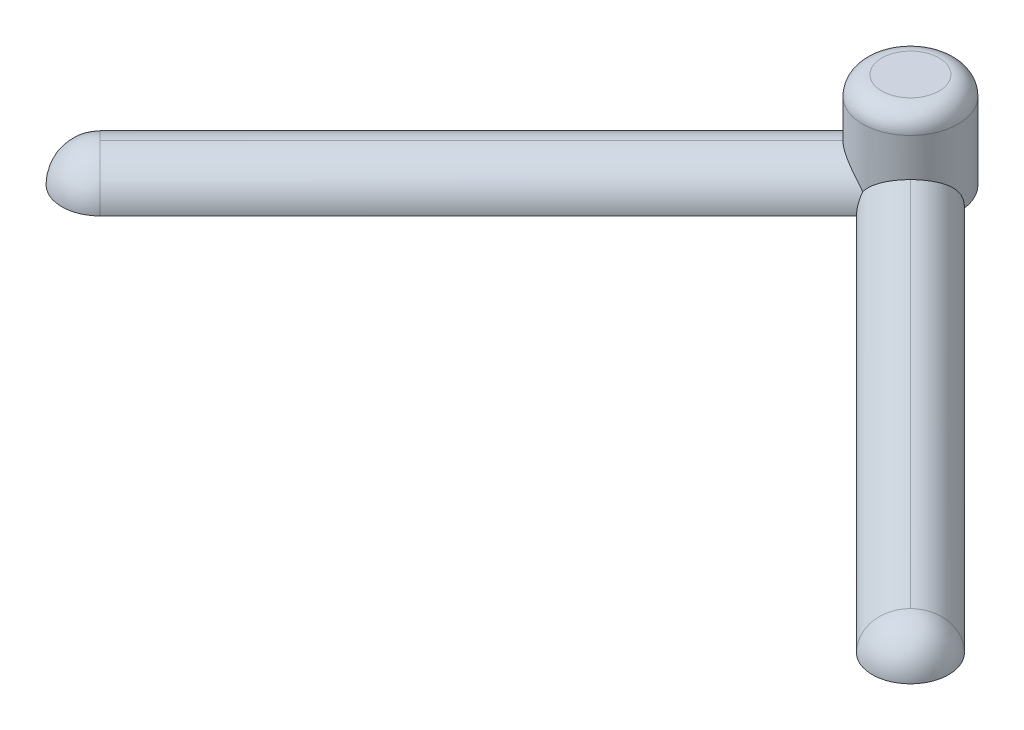
ISO-10303-21;
HEADER;
FILE_DESCRIPTION(('STEP AP214'),'2;1');
FILE_NAME('part.step','',(''),(''),'','','');
FILE_SCHEMA(('AUTOMOTIVE_DESIGN { 1 0 10303 214 1 1 1 1 }'));
ENDSEC;
DATA;
#1=APPLICATION_CONTEXT('core data for automotive mechanical design processes');
#2=APPLICATION_PROTOCOL_DEFINITION('international standard','automotive_design',2000,#1);
#3=PRODUCT_CONTEXT('',#1,'mechanical');
#4=PRODUCT('Part','Part','',(#3));
#5=PRODUCT_RELATED_PRODUCT_CATEGORY('part','',(#4));
#6=PRODUCT_DEFINITION_FORMATION('','',#4);
#7=PRODUCT_DEFINITION_CONTEXT('part definition',#1,'design');
#8=PRODUCT_DEFINITION('design','',#6,#7);
#9=PRODUCT_DEFINITION_SHAPE('','',#8);
#10=(LENGTH_UNIT() NAMED_UNIT(*) SI_UNIT(.MILLI.,.METRE.));
#11=(NAMED_UNIT(*) PLANE_ANGLE_UNIT() SI_UNIT($,.RADIAN.));
#12=(NAMED_UNIT(*) SI_UNIT($,.STERADIAN.) SOLID_ANGLE_UNIT());
#13=UNCERTAINTY_MEASURE_WITH_UNIT(LENGTH_MEASURE(1.E-05),#10,'distance_accuracy_value','');
#14=(GEOMETRIC_REPRESENTATION_CONTEXT(3) GLOBAL_UNCERTAINTY_ASSIGNED_CONTEXT((#13)) GLOBAL_UNIT_ASSIGNED_CONTEXT((#10,
#11,#12)) REPRESENTATION_CONTEXT('',''));
#15=CARTESIAN_POINT('',(0.,0.,0.));
#16=DIRECTION('',(0.,0.,1.));
#17=DIRECTION('',(1.,0.,0.));
#18=AXIS2_PLACEMENT_3D('',#15,#16,#17);
#19=CARTESIAN_POINT('',(-0.000544720985090328,-1.48589260613319,-11.9763136914915));
#20=DIRECTION('',(0.707106781186546,0.,0.707106781186549));
#21=DIRECTION('',(0.707106781186549,0.,-0.707106781186546));
#22=AXIS2_PLACEMENT_3D('',#19,#20,#21);
#23=CYLINDRICAL_SURFACE('',#22,5.08);
#24=DIRECTION('',(0.707106781186546,0.,0.707106781186549));
#25=VECTOR('',#24,1.);
#26=CARTESIAN_POINT('',(3.59155772744258,-1.48589260613319,-15.5684161399192));
#27=LINE('',#26,#25);
#28=CARTESIAN_POINT('',(6.28563456376332,-1.48589260613319,-12.8743393035984));
#29=VERTEX_POINT('',#28);
#30=CARTESIAN_POINT('',(57.4730944538574,-1.48589260613319,38.3131205864958));
#31=VERTEX_POINT('',#30);
#32=EDGE_CURVE('E104',#29,#31,#27,.T.);
#33=ORIENTED_EDGE('',*,*,#32,.F.);
#34=CARTESIAN_POINT('',(6.28563456376332,-1.48589260613319,-12.8743393035984));
#35=CARTESIAN_POINT('',(6.28560687343866,-1.38952133344319,-12.874398590198));
#36=CARTESIAN_POINT('',(6.28628053533132,-1.29318718390793,-12.8698165708757));
#37=CARTESIAN_POINT('',(6.28881998941499,-1.10151987343332,-12.8518347538349));
#38=CARTESIAN_POINT('',(6.29068375900634,-1.00618529258681,-12.8384499154398));
#39=CARTESIAN_POINT('',(6.29536284568703,-0.818369538849554,-12.8035580486937));
#40=CARTESIAN_POINT('',(6.29816517527972,-0.725867278659367,-12.7821614320215));
#41=CARTESIAN_POINT('',(6.30438713683916,-0.542895192935964,-12.7319442844917));
#42=CARTESIAN_POINT('',(6.30780707392281,-0.452426396948914,-12.7031200811618));
#43=CARTESIAN_POINT('',(6.31614420290003,-0.242044772751062,-12.6273596526522));
#44=CARTESIAN_POINT('',(6.32116031625539,-0.123140567235551,-12.5776303500585));
#45=CARTESIAN_POINT('',(6.33063984943054,0.109821550803948,-12.4678760672476));
#46=CARTESIAN_POINT('',(6.33510307545817,0.223877754908712,-12.4078474945246));
#47=CARTESIAN_POINT('',(6.34258103352951,0.447804098219018,-12.2787427023872));
#48=CARTESIAN_POINT('',(6.34558573043553,0.55764057804113,-12.2096078492536));
#49=CARTESIAN_POINT('',(6.34926820412654,0.772385704627742,-12.0639896058536));
#50=CARTESIAN_POINT('',(6.3499452515206,0.877292796566598,-11.9875039198509));
#51=CARTESIAN_POINT('',(6.34792010353161,1.11905266623983,-11.7997278911934));
#52=CARTESIAN_POINT('',(6.34391751786519,1.25385359851076,-11.6858001430698));
#53=CARTESIAN_POINT('',(6.32860898755788,1.51458866629605,-11.4486225902111));
#54=CARTESIAN_POINT('',(6.3173004654991,1.64051965524128,-11.3253695092003));
#55=CARTESIAN_POINT('',(6.28596108010473,1.88305739436845,-11.0715148750922));
#56=CARTESIAN_POINT('',(6.26594854214477,1.99968312856105,-10.9409292601906));
#57=CARTESIAN_POINT('',(6.21589356565084,2.22340230594481,-10.6736604985492));
#58=CARTESIAN_POINT('',(6.18584990646248,2.33049458703135,-10.5369766114851));
#59=CARTESIAN_POINT('',(6.0928785884912,2.5960806183242,-10.1747336347083));
#60=CARTESIAN_POINT('',(6.02105017971605,2.74653410926254,-9.94537576858528));
#61=CARTESIAN_POINT('',(5.84400298290282,3.01590878359584,-9.48125339129859));
#62=CARTESIAN_POINT('',(5.73883042147823,3.13487320533484,-9.24649678009015));
#63=CARTESIAN_POINT('',(5.51235852973103,3.31906099499423,-8.81731920497968));
#64=CARTESIAN_POINT('',(5.39641963312166,3.3898645937583,-8.62251610973942));
#65=CARTESIAN_POINT('',(5.20396235945643,3.47354035705903,-8.33641026097956));
#66=CARTESIAN_POINT('',(5.13669707683882,3.49768092993253,-8.24203261592158));
#67=CARTESIAN_POINT('',(4.99623154509985,3.53811323212339,-8.056074670879));
#68=CARTESIAN_POINT('',(4.92303367850959,3.554408094216,-7.96449326806484));
#69=CARTESIAN_POINT('',(4.77079465256414,3.57893123376448,-7.78456357305909));
#70=CARTESIAN_POINT('',(4.69173166858077,3.58712757183673,-7.69622939472094));
#71=CARTESIAN_POINT('',(4.52860282960779,3.59520178379152,-7.5239675980462));
#72=CARTESIAN_POINT('',(4.44453891877176,3.59508286945693,-7.44003829085488));
#73=CARTESIAN_POINT('',(4.27204162364971,3.58653472500343,-7.27720983376972));
#74=CARTESIAN_POINT('',(4.18360727308806,3.57810364924151,-7.19831180516986));
#75=CARTESIAN_POINT('',(4.00315542420914,3.5530748949364,-7.04611917758313));
#76=CARTESIAN_POINT('',(3.91113800866418,3.53647740494244,-6.97282444927033));
#77=CARTESIAN_POINT('',(3.7294528541865,3.49651506146611,-6.83609733078554));
#78=CARTESIAN_POINT('',(3.63993299863199,3.473571250475,-6.77234451746375));
#79=CARTESIAN_POINT('',(3.45908923476936,3.42094668932426,-6.65040089992663));
#80=CARTESIAN_POINT('',(3.36776475407488,3.3912637693116,-6.59221189573688));
#81=CARTESIAN_POINT('',(3.09212678113641,3.29264885505418,-6.42619784110683));
#82=CARTESIAN_POINT('',(2.90603227577244,3.21412458732896,-6.32683902381194));
#83=CARTESIAN_POINT('',(2.5162709417158,3.02614154974426,-6.14200753609368));
#84=CARTESIAN_POINT('',(2.31264015451776,2.91442986083378,-6.05879799104042));
#85=CARTESIAN_POINT('',(1.91083577401473,2.66815531339362,-5.91705822939811));
#86=CARTESIAN_POINT('',(1.71266395820597,2.53358511176745,-5.85853596449152));
#87=CARTESIAN_POINT('',(1.28601411134143,2.21480841644506,-5.75338507873348));
#88=CARTESIAN_POINT('',(1.05967919967805,2.02608484233434,-5.71167355868476));
#89=CARTESIAN_POINT('',(0.735673659227465,1.72363087044101,-5.66818711425819));
#90=CARTESIAN_POINT('',(0.630106865350904,1.619412559539,-5.65686917368405));
#91=CARTESIAN_POINT('',(0.425146056920984,1.40460582851687,-5.63976592037488));
#92=CARTESIAN_POINT('',(0.325751425191031,1.29401804744131,-5.6339800536323));
#93=CARTESIAN_POINT('',(0.143393804124363,1.07728630889195,-5.6273526674033));
#94=CARTESIAN_POINT('',(0.0597660923152862,0.971713103601933,-5.62609484813119));
#95=CARTESIAN_POINT('',(-0.100367362975639,0.75531027817777,-5.62659399870463));
#96=CARTESIAN_POINT('',(-0.176874545773372,0.644481727205406,-5.62835035787453));
#97=CARTESIAN_POINT('',(-0.320971367772488,0.418162542681024,-5.6339959722248));
#98=CARTESIAN_POINT('',(-0.388613376639751,0.302705090829133,-5.63787193003228));
#99=CARTESIAN_POINT('',(-0.513850861096154,0.0664689904897944,-5.64678310116898));
#100=CARTESIAN_POINT('',(-0.571447797925895,-0.0543088808375658,-5.65181814564008));
#101=CARTESIAN_POINT('',(-0.665899534441111,-0.280222033573186,-5.66112020076014));
#102=CARTESIAN_POINT('',(-0.704613345136965,-0.384577368604516,-5.66537416655974));
#103=CARTESIAN_POINT('',(-0.772388959415728,-0.596350725050921,-5.67330533201825));
#104=CARTESIAN_POINT('',(-0.801457773366283,-0.703766460108495,-5.67698294955955));
#105=CARTESIAN_POINT('',(-0.849106107237057,-0.922762840511855,-5.68321673057724));
#106=CARTESIAN_POINT('',(-0.86751148101897,-1.03438255330598,-5.68575413129931));
#107=CARTESIAN_POINT('',(-0.892314050455706,-1.25926970035718,-5.6892404561162));
#108=CARTESIAN_POINT('',(-0.898678161942967,-1.37254081510208,-5.69018500296845));
#109=CARTESIAN_POINT('',(-0.898570333091884,-1.48589260613326,-5.69013440674293));
#110=B_SPLINE_CURVE_WITH_KNOTS('',3,(#34,#35,#36,#37,#38,#39,#40,#41,#42,#43,#44,#45,#46,#47,
#48,#49,#50,#51,#52,#53,#54,#55,#56,#57,#58,#59,#60,#61,#62,#63,#64,#65,#66,#67,#68,#69,#70,#71,
#72,#73,#74,#75,#76,#77,#78,#79,#80,#81,#82,#83,#84,#85,#86,#87,#88,#89,#90,#91,#92,#93,#94,#95,
#96,#97,#98,#99,#100,#101,#102,#103,#104,#105,#106,#107,#108,#109),.UNSPECIFIED.,.F.,.F.,(4,2,2,
2,2,2,2,2,2,2,2,2,2,2,2,2,2,2,2,2,2,2,2,2,2,2,2,2,2,2,2,2,2,2,2,2,2,4),(0.,0.288943271408598,
0.57739678315812,0.862013219890417,1.14677065239287,1.53310529362778,1.91957496788342,
2.30866725784125,2.6978814624321,3.22682191321525,3.75594906772893,4.28396755380015,
4.81205031614939,5.65921538306813,6.50521108223099,7.21436204207328,7.56913565648601,
7.9237674928443,8.27979242790322,8.63567984837816,8.99164630835425,9.34760455002942,
9.68404185267042,10.020587635143,10.6932413944981,11.4307626552317,12.1685212878133,
13.0579210691339,13.5039711521296,13.9499765609194,14.353750093045,14.7574418298957,
15.1586295719839,15.559758905165,15.8935135225167,16.2270250195821,16.5658398601141,
16.9055842726656),.UNSPECIFIED.);
#111=CARTESIAN_POINT('',(4.48958333954948,3.59410739386681,-7.48618563095693));
#112=VERTEX_POINT('',#111);
#113=EDGE_CURVE('E132',#29,#112,#110,.T.);
#114=ORIENTED_EDGE('',*,*,#113,.T.);
#115=DIRECTION('',(0.707106781186546,0.,0.707106781186549));
#116=VECTOR('',#115,1.);
#117=CARTESIAN_POINT('',(-0.000544720985090111,3.59410739386681,-11.9763136914915));
#118=LINE('',#117,#116);
#119=CARTESIAN_POINT('',(53.8809920054298,3.59410739386681,41.9052230349235));
#120=VERTEX_POINT('',#119);
#121=EDGE_CURVE('E115',#120,#112,#118,.F.);
#122=ORIENTED_EDGE('',*,*,#121,.F.);
#123=CARTESIAN_POINT('',(53.8809920054297,-1.48589260613319,41.9052230349235));
#124=DIRECTION('',(0.707106781186546,0.,0.707106781186549));
#125=DIRECTION('',(0.707106781186549,0.,-0.707106781186546));
#126=AXIS2_PLACEMENT_3D('',#123,#124,#125);
#127=CIRCLE('',#126,5.08);
#128=EDGE_CURVE('E90',#31,#120,#127,.T.);
#129=ORIENTED_EDGE('',*,*,#128,.F.);
#130=EDGE_LOOP('',(#33,#114,#122,#129));
#131=FACE_BOUND('',#130,.T.);
#132=ADVANCED_FACE('F49',(#131),#23,.T.);
#133=CARTESIAN_POINT('',(-0.000544720985088376,-1.48589260613319,-11.9763136914915));
#134=DIRECTION('',(-0.707106781186547,0.,-0.707106781186549));
#135=DIRECTION('',(-0.707106781186549,0.,0.707106781186547));
#136=AXIS2_PLACEMENT_3D('',#133,#134,#135);
#137=CYLINDRICAL_SURFACE('',#136,5.08);
#138=ORIENTED_EDGE('',*,*,#121,.T.);
#139=CARTESIAN_POINT('',(6.28563456376332,-1.48589260613319,-12.8743393035984));
#140=CARTESIAN_POINT('',(6.28560687343866,-1.38952133344319,-12.874398590198));
#141=CARTESIAN_POINT('',(6.28628053533132,-1.29318718390793,-12.8698165708757));
#142=CARTESIAN_POINT('',(6.28881998941499,-1.10151987343332,-12.8518347538349));
#143=CARTESIAN_POINT('',(6.29068375900634,-1.00618529258681,-12.8384499154398));
#144=CARTESIAN_POINT('',(6.29536284568702,-0.818369538849554,-12.8035580486937));
#145=CARTESIAN_POINT('',(6.29816517527972,-0.725867278659367,-12.7821614320215));
#146=CARTESIAN_POINT('',(6.30438713683916,-0.542895192935965,-12.7319442844917));
#147=CARTESIAN_POINT('',(6.30780707392281,-0.452426396948914,-12.7031200811618));
#148=CARTESIAN_POINT('',(6.31614420290002,-0.242044772751063,-12.6273596526522));
#149=CARTESIAN_POINT('',(6.32116031625539,-0.123140567235552,-12.5776303500585));
#150=CARTESIAN_POINT('',(6.33063984943054,0.109821550803948,-12.4678760672476));
#151=CARTESIAN_POINT('',(6.33510307545817,0.223877754908711,-12.4078474945246));
#152=CARTESIAN_POINT('',(6.34258103352951,0.447804098219017,-12.2787427023872));
#153=CARTESIAN_POINT('',(6.34558573043553,0.557640578041128,-12.2096078492536));
#154=CARTESIAN_POINT('',(6.34926820412654,0.77238570462774,-12.0639896058536));
#155=CARTESIAN_POINT('',(6.3499452515206,0.877292796566596,-11.9875039198509));
#156=CARTESIAN_POINT('',(6.34792010353161,1.11905266623983,-11.7997278911934));
#157=CARTESIAN_POINT('',(6.34391751786519,1.25385359851076,-11.6858001430699));
#158=CARTESIAN_POINT('',(6.32860898755788,1.51458866629604,-11.4486225902111));
#159=CARTESIAN_POINT('',(6.3173004654991,1.64051965524127,-11.3253695092003));
#160=CARTESIAN_POINT('',(6.28596108010473,1.88305739436844,-11.0715148750922));
#161=CARTESIAN_POINT('',(6.26594854214477,1.99968312856105,-10.9409292601906));
#162=CARTESIAN_POINT('',(6.21589356565084,2.22340230594481,-10.6736604985492));
#163=CARTESIAN_POINT('',(6.18584990646248,2.33049458703135,-10.5369766114851));
#164=CARTESIAN_POINT('',(6.0928785884912,2.5960806183242,-10.1747336347083));
#165=CARTESIAN_POINT('',(6.02105017971605,2.74653410926254,-9.94537576858528));
#166=CARTESIAN_POINT('',(5.84400298290282,3.01590878359584,-9.4812533912986));
#167=CARTESIAN_POINT('',(5.73883042147824,3.13487320533484,-9.24649678009016));
#168=CARTESIAN_POINT('',(5.51235852973104,3.31906099499423,-8.81731920497968));
#169=CARTESIAN_POINT('',(5.39641963312166,3.3898645937583,-8.62251610973942));
#170=CARTESIAN_POINT('',(5.20396235945643,3.47354035705903,-8.33641026097956));
#171=CARTESIAN_POINT('',(5.13669707683882,3.49768092993253,-8.24203261592158));
#172=CARTESIAN_POINT('',(4.99623154509985,3.53811323212339,-8.056074670879));
#173=CARTESIAN_POINT('',(4.92303367850959,3.554408094216,-7.96449326806484));
#174=CARTESIAN_POINT('',(4.77079465256414,3.57893123376448,-7.78456357305909));
#175=CARTESIAN_POINT('',(4.69173166858078,3.58712757183673,-7.69622939472094));
#176=CARTESIAN_POINT('',(4.52860282960779,3.59520178379152,-7.5239675980462));
#177=CARTESIAN_POINT('',(4.44453891877176,3.59508286945694,-7.44003829085488));
#178=CARTESIAN_POINT('',(4.27204162364972,3.58653472500343,-7.27720983376972));
#179=CARTESIAN_POINT('',(4.18360727308806,3.57810364924151,-7.19831180516986));
#180=CARTESIAN_POINT('',(4.00315542420914,3.5530748949364,-7.04611917758314));
#181=CARTESIAN_POINT('',(3.91113800866419,3.53647740494244,-6.97282444927033));
#182=CARTESIAN_POINT('',(3.72945285418651,3.49651506146611,-6.83609733078554));
#183=CARTESIAN_POINT('',(3.63993299863199,3.473571250475,-6.77234451746376));
#184=CARTESIAN_POINT('',(3.45908923476936,3.42094668932426,-6.65040089992664));
#185=CARTESIAN_POINT('',(3.36776475407488,3.3912637693116,-6.59221189573688));
#186=CARTESIAN_POINT('',(3.09212678113642,3.29264885505418,-6.42619784110683));
#187=CARTESIAN_POINT('',(2.90603227577244,3.21412458732896,-6.32683902381194));
#188=CARTESIAN_POINT('',(2.51627094171581,3.02614154974426,-6.14200753609368));
#189=CARTESIAN_POINT('',(2.31264015451776,2.91442986083378,-6.05879799104042));
#190=CARTESIAN_POINT('',(1.91083577401473,2.66815531339362,-5.91705822939811));
#191=CARTESIAN_POINT('',(1.71266395820597,2.53358511176745,-5.85853596449152));
#192=CARTESIAN_POINT('',(1.28601411134143,2.21480841644505,-5.75338507873348));
#193=CARTESIAN_POINT('',(1.05967919967805,2.02608484233433,-5.71167355868476));
#194=CARTESIAN_POINT('',(0.735673659227468,1.72363087044101,-5.66818711425819));
#195=CARTESIAN_POINT('',(0.630106865350907,1.619412559539,-5.65686917368405));
#196=CARTESIAN_POINT('',(0.425146056920987,1.40460582851686,-5.63976592037488));
#197=CARTESIAN_POINT('',(0.325751425191035,1.29401804744131,-5.6339800536323));
#198=CARTESIAN_POINT('',(0.143393804124367,1.07728630889195,-5.6273526674033));
#199=CARTESIAN_POINT('',(0.0597660923152901,0.97171310360193,-5.62609484813119));
#200=CARTESIAN_POINT('',(-0.100367362975635,0.755310278177767,-5.62659399870463));
#201=CARTESIAN_POINT('',(-0.176874545773368,0.644481727205404,-5.62835035787453));
#202=CARTESIAN_POINT('',(-0.320971367772483,0.418162542681023,-5.6339959722248));
#203=CARTESIAN_POINT('',(-0.388613376639747,0.302705090829132,-5.63787193003228));
#204=CARTESIAN_POINT('',(-0.513850861096148,0.066468990489792,-5.64678310116898));
#205=CARTESIAN_POINT('',(-0.571447797925888,-0.0543088808375686,-5.65181814564008));
#206=CARTESIAN_POINT('',(-0.665899534441104,-0.280222033573189,-5.66112020076014));
#207=CARTESIAN_POINT('',(-0.704613345136959,-0.384577368604519,-5.66537416655974));
#208=CARTESIAN_POINT('',(-0.772388959415722,-0.596350725050924,-5.67330533201825));
#209=CARTESIAN_POINT('',(-0.801457773366275,-0.703766460108497,-5.67698294955954));
#210=CARTESIAN_POINT('',(-0.84910610723705,-0.922762840511856,-5.68321673057724));
#211=CARTESIAN_POINT('',(-0.867511481018963,-1.03438255330598,-5.6857541312993));
#212=CARTESIAN_POINT('',(-0.8923140504557,-1.25926970035718,-5.6892404561162));
#213=CARTESIAN_POINT('',(-0.898678161942962,-1.37254081510208,-5.69018500296845));
#214=CARTESIAN_POINT('',(-0.898570333091877,-1.48589260613326,-5.69013440674293));
#215=B_SPLINE_CURVE_WITH_KNOTS('',3,(#139,#140,#141,#142,#143,#144,#145,#146,#147,#148,#149,
#150,#151,#152,#153,#154,#155,#156,#157,#158,#159,#160,#161,#162,#163,#164,#165,#166,#167,#168,
#169,#170,#171,#172,#173,#174,#175,#176,#177,#178,#179,#180,#181,#182,#183,#184,#185,#186,#187,
#188,#189,#190,#191,#192,#193,#194,#195,#196,#197,#198,#199,#200,#201,#202,#203,#204,#205,#206,
#207,#208,#209,#210,#211,#212,#213,#214),.UNSPECIFIED.,.F.,.F.,(4,2,2,2,2,2,2,2,2,2,2,2,2,2,2,2,
2,2,2,2,2,2,2,2,2,2,2,2,2,2,2,2,2,2,2,2,2,4),(0.,0.288943271408598,0.577396783158119,
0.862013219890417,1.14677065239286,1.53310529362778,1.91957496788342,2.30866725784125,
2.6978814624321,3.22682191321524,3.75594906772892,4.28396755380015,4.81205031614939,
5.65921538306813,6.50521108223099,7.21436204207328,7.56913565648601,7.9237674928443,
8.27979242790322,8.63567984837816,8.99164630835425,9.34760455002943,9.68404185267042,
10.020587635143,10.6932413944981,11.4307626552317,12.1685212878134,13.0579210691339,
13.5039711521296,13.9499765609195,14.353750093045,14.7574418298957,15.1586295719839,
15.559758905165,15.8935135225167,16.2270250195821,16.5658398601141,16.9055842726656),.UNSPECIFIED.);
#216=CARTESIAN_POINT('',(-0.000544720985113891,0.890059834468233,-5.62631369149151));
#217=VERTEX_POINT('',#216);
#218=EDGE_CURVE('E171',#112,#217,#215,.T.);
#219=ORIENTED_EDGE('',*,*,#218,.T.);
#220=CARTESIAN_POINT('',(-0.000544720985092713,-1.48589260613319,-11.9763136914915));
#221=DIRECTION('',(-1.,0.,0.));
#222=DIRECTION('',(0.,0.,-1.));
#223=AXIS2_PLACEMENT_3D('',#220,#221,#222);
#224=ELLIPSE('',#223,7.18420489685531,5.08);
#225=CARTESIAN_POINT('',(-0.000544720985117216,-1.48589260613319,-4.79210879463621));
#226=VERTEX_POINT('',#225);
#227=EDGE_CURVE('E135',#226,#217,#224,.T.);
#228=ORIENTED_EDGE('',*,*,#227,.F.);
#229=DIRECTION('',(0.707106781186546,0.,0.707106781186549));
#230=VECTOR('',#229,1.);
#231=CARTESIAN_POINT('',(-3.59264716941276,-1.48589260613319,-8.38421124306386));
#232=LINE('',#231,#230);
#233=CARTESIAN_POINT('',(50.2888895570021,-1.48589260613319,45.4973254833511));
#234=VERTEX_POINT('',#233);
#235=EDGE_CURVE('E96',#226,#234,#232,.T.);
#236=ORIENTED_EDGE('',*,*,#235,.T.);
#237=CARTESIAN_POINT('',(53.8809920054297,-1.48589260613319,41.9052230349235));
#238=DIRECTION('',(-0.707106781186545,0.,-0.70710678118655));
#239=DIRECTION('',(-0.70710678118655,0.,0.707106781186545));
#240=AXIS2_PLACEMENT_3D('',#237,#238,#239);
#241=CIRCLE('',#240,5.08);
#242=EDGE_CURVE('E119',#234,#120,#241,.T.);
#243=ORIENTED_EDGE('',*,*,#242,.T.);
#244=EDGE_LOOP('',(#138,#219,#228,#236,#243));
#245=FACE_BOUND('',#244,.T.);
#246=ADVANCED_FACE('F182',(#245),#137,.T.);
#247=CARTESIAN_POINT('',(-0.000544720985084257,-1.48589260613319,-11.9763136914915));
#248=DIRECTION('',(0.707106781186551,0.,-0.707106781186544));
#249=DIRECTION('',(-0.707106781186544,0.,-0.707106781186551));
#250=AXIS2_PLACEMENT_3D('',#247,#248,#249);
#251=CYLINDRICAL_SURFACE('',#250,5.08);
#252=DIRECTION('',(-0.707106781186551,0.,0.707106781186544));
#253=VECTOR('',#252,1.);
#254=CARTESIAN_POINT('',(-53.8820814474003,3.59410739386681,41.9052230349231));
#255=LINE('',#254,#253);
#256=CARTESIAN_POINT('',(-4.49067278151968,3.59410739386681,-7.48618563095695));
#257=VERTEX_POINT('',#256);
#258=CARTESIAN_POINT('',(-53.8820814474003,3.59410739386681,41.9052230349231));
#259=VERTEX_POINT('',#258);
#260=EDGE_CURVE('E138',#257,#259,#255,.T.);
#261=ORIENTED_EDGE('',*,*,#260,.F.);
#262=CARTESIAN_POINT('',(0.897480891121806,-1.48589260613319,-5.6901344067431));
#263=CARTESIAN_POINT('',(0.897540177721354,-1.38952133344319,-5.69016209706776));
#264=CARTESIAN_POINT('',(0.892958158399129,-1.29318718390793,-5.6894884351751));
#265=CARTESIAN_POINT('',(0.874976341358282,-1.10151987343332,-5.68694898109143));
#266=CARTESIAN_POINT('',(0.861591502963183,-1.00618529258681,-5.68508521150009));
#267=CARTESIAN_POINT('',(0.826699636217114,-0.818369538849555,-5.6804061248194));
#268=CARTESIAN_POINT('',(0.805303019544885,-0.725867278659369,-5.6776037952267));
#269=CARTESIAN_POINT('',(0.755085872015078,-0.542895192935967,-5.67138183366727));
#270=CARTESIAN_POINT('',(0.726261668685153,-0.452426396948917,-5.66796189658361));
#271=CARTESIAN_POINT('',(0.650501240175545,-0.242044772751066,-5.6596247676064));
#272=CARTESIAN_POINT('',(0.600771937581904,-0.123140567235556,-5.65460865425103));
#273=CARTESIAN_POINT('',(0.491017654770948,0.109821550803942,-5.64512912107588));
#274=CARTESIAN_POINT('',(0.430989082048024,0.223877754908705,-5.64066589504826));
#275=CARTESIAN_POINT('',(0.301884289910594,0.447804098219011,-5.63318793697692));
#276=CARTESIAN_POINT('',(0.232749436776979,0.557640578041123,-5.6301832400709));
#277=CARTESIAN_POINT('',(0.0871311933769719,0.772385704627735,-5.62650076637988));
#278=CARTESIAN_POINT('',(0.0106455073743108,0.87729279656659,-5.62582371898583));
#279=CARTESIAN_POINT('',(-0.177130521283256,1.11905266623983,-5.62784886697481));
#280=CARTESIAN_POINT('',(-0.291058269406766,1.25385359851075,-5.63185145264124));
#281=CARTESIAN_POINT('',(-0.528235822265509,1.51458866629604,-5.64715998294854));
#282=CARTESIAN_POINT('',(-0.651488903276297,1.64051965524127,-5.65846850500732));
#283=CARTESIAN_POINT('',(-0.905343537384376,1.88305739436844,-5.68980789040169));
#284=CARTESIAN_POINT('',(-1.03592915228599,1.99968312856105,-5.70982042836166));
#285=CARTESIAN_POINT('',(-1.3031979139274,2.22340230594481,-5.75987540485558));
#286=CARTESIAN_POINT('',(-1.43988180099147,2.33049458703135,-5.78991906404395));
#287=CARTESIAN_POINT('',(-1.80212477776833,2.59608061832419,-5.88289038201523));
#288=CARTESIAN_POINT('',(-2.03148264389133,2.74653410926254,-5.95471879079038));
#289=CARTESIAN_POINT('',(-2.49560502117802,3.01590878359584,-6.13176598760361));
#290=CARTESIAN_POINT('',(-2.73036163238646,3.13487320533484,-6.23693854902819));
#291=CARTESIAN_POINT('',(-3.15953920749693,3.31906099499423,-6.46341044077539));
#292=CARTESIAN_POINT('',(-3.35434230273719,3.3898645937583,-6.57934933738477));
#293=CARTESIAN_POINT('',(-3.64044815149706,3.47354035705903,-6.77180661105));
#294=CARTESIAN_POINT('',(-3.73482579655503,3.49768092993253,-6.83907189366761));
#295=CARTESIAN_POINT('',(-3.92078374159761,3.53811323212339,-6.97953742540658));
#296=CARTESIAN_POINT('',(-4.01236514441178,3.554408094216,-7.05273529199684));
#297=CARTESIAN_POINT('',(-4.19229483941752,3.57893123376448,-7.20497431794229));
#298=CARTESIAN_POINT('',(-4.28062901775567,3.58712757183673,-7.28403730192566));
#299=CARTESIAN_POINT('',(-4.45289081443042,3.59520178379152,-7.44716614089864));
#300=CARTESIAN_POINT('',(-4.53682012162174,3.59508286945694,-7.53123005173467));
#301=CARTESIAN_POINT('',(-4.69964857870689,3.58653472500343,-7.70372734685672));
#302=CARTESIAN_POINT('',(-4.77854660730676,3.57810364924151,-7.79216169741838));
#303=CARTESIAN_POINT('',(-4.93073923489348,3.5530748949364,-7.9726135462973));
#304=CARTESIAN_POINT('',(-5.00403396320628,3.53647740494244,-8.06463096184225));
#305=CARTESIAN_POINT('',(-5.14076108169108,3.49651506146611,-8.24631611631993));
#306=CARTESIAN_POINT('',(-5.20451389501286,3.473571250475,-8.33583597187445));
#307=CARTESIAN_POINT('',(-5.32645751254998,3.42094668932426,-8.51667973573708));
#308=CARTESIAN_POINT('',(-5.38464651673973,3.3912637693116,-8.60800421643156));
#309=CARTESIAN_POINT('',(-5.55066057136978,3.29264885505417,-8.88364218937003));
#310=CARTESIAN_POINT('',(-5.65001938866468,3.21412458732896,-9.069736694734));
#311=CARTESIAN_POINT('',(-5.83485087638293,3.02614154974426,-9.45949802879064));
#312=CARTESIAN_POINT('',(-5.91806042143619,2.91442986083378,-9.66312881598868));
#313=CARTESIAN_POINT('',(-6.0598001830785,2.66815531339362,-10.0649331964917));
#314=CARTESIAN_POINT('',(-6.11832244798509,2.53358511176745,-10.2631050123005));
#315=CARTESIAN_POINT('',(-6.22347333374313,2.21480841644505,-10.689754859165));
#316=CARTESIAN_POINT('',(-6.26518485379185,2.02608484233433,-10.9160897708284));
#317=CARTESIAN_POINT('',(-6.30867129821842,1.72363087044101,-11.240095311279));
#318=CARTESIAN_POINT('',(-6.31998923879256,1.619412559539,-11.3456621051555));
#319=CARTESIAN_POINT('',(-6.33709249210173,1.40460582851686,-11.5506229135855));
#320=CARTESIAN_POINT('',(-6.34287835884431,1.29401804744131,-11.6500175453154));
#321=CARTESIAN_POINT('',(-6.34950574507331,1.07728630889195,-11.8323751663821));
#322=CARTESIAN_POINT('',(-6.35076356434541,0.97171310360193,-11.9160028781912));
#323=CARTESIAN_POINT('',(-6.35026441377197,0.755310278177767,-12.0761363334821));
#324=CARTESIAN_POINT('',(-6.34850805460207,0.644481727205403,-12.1526435162798));
#325=CARTESIAN_POINT('',(-6.34286244025181,0.418162542681021,-12.2967403382789));
#326=CARTESIAN_POINT('',(-6.33898648244433,0.302705090829129,-12.3643823471462));
#327=CARTESIAN_POINT('',(-6.33007531130762,0.0664689904897903,-12.4896198316026));
#328=CARTESIAN_POINT('',(-6.32504026683652,-0.054308880837569,-12.5472167684323));
#329=CARTESIAN_POINT('',(-6.31573821171647,-0.280222033573189,-12.6416685049475));
#330=CARTESIAN_POINT('',(-6.31148424591686,-0.384577368604519,-12.6803823156434));
#331=CARTESIAN_POINT('',(-6.30355308045835,-0.596350725050926,-12.7481579299222));
#332=CARTESIAN_POINT('',(-6.29987546291706,-0.703766460108499,-12.7772267438727));
#333=CARTESIAN_POINT('',(-6.29364168189936,-0.922762840511859,-12.8248750777435));
#334=CARTESIAN_POINT('',(-6.2911042811773,-1.03438255330598,-12.8432804515254));
#335=CARTESIAN_POINT('',(-6.28761795636041,-1.25926970035718,-12.8680830209621));
#336=CARTESIAN_POINT('',(-6.28667340950815,-1.37254081510208,-12.8744471324494));
#337=CARTESIAN_POINT('',(-6.28672400573367,-1.48589260613326,-12.8743393035983));
#338=B_SPLINE_CURVE_WITH_KNOTS('',3,(#262,#263,#264,#265,#266,#267,#268,#269,#270,#271,#272,
#273,#274,#275,#276,#277,#278,#279,#280,#281,#282,#283,#284,#285,#286,#287,#288,#289,#290,#291,
#292,#293,#294,#295,#296,#297,#298,#299,#300,#301,#302,#303,#304,#305,#306,#307,#308,#309,#310,
#311,#312,#313,#314,#315,#316,#317,#318,#319,#320,#321,#322,#323,#324,#325,#326,#327,#328,#329,
#330,#331,#332,#333,#334,#335,#336,#337),.UNSPECIFIED.,.F.,.F.,(4,2,2,2,2,2,2,2,2,2,2,2,2,2,2,2,
2,2,2,2,2,2,2,2,2,2,2,2,2,2,2,2,2,2,2,2,2,4),(0.,0.288943271408598,0.577396783158118,
0.862013219890414,1.14677065239286,1.53310529362778,1.91957496788341,2.30866725784125,
2.69788146243209,3.22682191321524,3.75594906772892,4.28396755380015,4.81205031614939,
5.65921538306812,6.50521108223098,7.21436204207327,7.56913565648601,7.9237674928443,
8.27979242790322,8.63567984837816,8.99164630835425,9.34760455002943,9.68404185267043,
10.020587635143,10.6932413944981,11.4307626552317,12.1685212878134,13.0579210691339,
13.5039711521296,13.9499765609195,14.353750093045,14.7574418298957,15.1586295719839,
15.559758905165,15.8935135225167,16.2270250195821,16.5658398601141,16.9055842726656),.UNSPECIFIED.);
#339=CARTESIAN_POINT('',(-6.28672400573349,-1.48589260613319,-12.8743393035985));
#340=VERTEX_POINT('',#339);
#341=EDGE_CURVE('E64',#257,#340,#338,.T.);
#342=ORIENTED_EDGE('',*,*,#341,.T.);
#343=DIRECTION('',(-0.707106781186551,0.,0.707106781186544));
#344=VECTOR('',#343,1.);
#345=CARTESIAN_POINT('',(-3.59264716941273,-1.48589260613319,-15.5684161399192));
#346=LINE('',#345,#344);
#347=CARTESIAN_POINT('',(-57.4741838958279,-1.48589260613319,38.3131205864955));
#348=VERTEX_POINT('',#347);
#349=EDGE_CURVE('E112',#340,#348,#346,.T.);
#350=ORIENTED_EDGE('',*,*,#349,.T.);
#351=CARTESIAN_POINT('',(-53.8820814474003,-1.48589260613319,41.9052230349231));
#352=DIRECTION('',(-0.707106781186551,0.,0.707106781186544));
#353=DIRECTION('',(0.707106781186544,0.,0.707106781186551));
#354=AXIS2_PLACEMENT_3D('',#351,#352,#353);
#355=CIRCLE('',#354,5.08);
#356=EDGE_CURVE('E131',#259,#348,#355,.T.);
#357=ORIENTED_EDGE('',*,*,#356,.F.);
#358=EDGE_LOOP('',(#261,#342,#350,#357));
#359=FACE_BOUND('',#358,.T.);
#360=ADVANCED_FACE('F186',(#359),#251,.T.);
#361=CARTESIAN_POINT('',(-0.000544720985094231,-1.48589260613319,-11.9763136914915));
#362=DIRECTION('',(-0.707106781186551,0.,0.707106781186544));
#363=DIRECTION('',(0.707106781186544,0.,0.707106781186551));
#364=AXIS2_PLACEMENT_3D('',#361,#362,#363);
#365=CYLINDRICAL_SURFACE('',#364,5.08);
#366=ORIENTED_EDGE('',*,*,#227,.T.);
#367=CARTESIAN_POINT('',(0.897480891121783,-1.48589260613319,-5.6901344067431));
#368=CARTESIAN_POINT('',(0.897540175908019,-1.38952205645268,-5.69016209626603));
#369=CARTESIAN_POINT('',(0.892958226202258,-1.29318862919964,-5.68948844486731));
#370=CARTESIAN_POINT('',(0.874976677247045,-1.101522739941,-5.68694902818393));
#371=CARTESIAN_POINT('',(0.861592036763791,-1.00618885809161,-5.68508528542529));
#372=CARTESIAN_POINT('',(0.826700416911428,-0.818373055731862,-5.68040622734898));
#373=CARTESIAN_POINT('',(0.805303725397712,-0.725870071745145,-5.67760388500544));
#374=CARTESIAN_POINT('',(0.75508630969272,-0.542896566396876,-5.67138188556161));
#375=CARTESIAN_POINT('',(0.726261912904586,-0.452427074614413,-5.66796192333281));
#376=CARTESIAN_POINT('',(0.65050100124419,-0.242044109954252,-5.65962474148413));
#377=CARTESIAN_POINT('',(0.600771392198309,-0.123139265655252,-5.65460859997174));
#378=CARTESIAN_POINT('',(0.49101639800107,0.109824074232912,-5.64512901969599));
#379=CARTESIAN_POINT('',(0.430987420198423,0.223880861329831,-5.64066577473403));
#380=CARTESIAN_POINT('',(0.301882383738156,0.447807178833306,-5.63318785078062));
#381=CARTESIAN_POINT('',(0.232747780021111,0.5576431008041,-5.63018319187226));
#382=CARTESIAN_POINT('',(0.0871302748518675,0.772386979656286,-5.62650074947134));
#383=CARTESIAN_POINT('',(0.0106450877353908,0.877293388508639,-5.62582369216879));
#384=CARTESIAN_POINT('',(-0.177130985179546,1.11905319329428,-5.62784891457304));
#385=CARTESIAN_POINT('',(-0.291059453537442,1.25385473539585,-5.63185166989058));
#386=CARTESIAN_POINT('',(-0.528237138648654,1.51459027837559,-5.64715992707137));
#387=CARTESIAN_POINT('',(-0.651489635245967,1.64052112851249,-5.6584680093203));
#388=CARTESIAN_POINT('',(-0.905340772733012,1.88305398076118,-5.68980813386422));
#389=CARTESIAN_POINT('',(-1.03592300905702,1.99967550309424,-5.70982132213258));
#390=CARTESIAN_POINT('',(-1.30317892651712,2.22338889599614,-5.75986980354506));
#391=CARTESIAN_POINT('',(-1.43985398168202,2.33047860050241,-5.78990736735522));
#392=CARTESIAN_POINT('',(-1.8021318680216,2.59607874358853,-5.88289951057384));
#393=CARTESIAN_POINT('',(-2.03158902654987,2.74658253974751,-5.95477792487355));
#394=CARTESIAN_POINT('',(-2.37962468714917,2.94860093750588,-6.08751408820099));
#395=CARTESIAN_POINT('',(-2.49627212378092,3.01198153540644,-6.13590943365226));
#396=CARTESIAN_POINT('',(-2.73000894376433,3.13016303189192,-6.24142648476722));
#397=CARTESIAN_POINT('',(-2.84709823474767,3.18496563185075,-6.29854645552268));
#398=CARTESIAN_POINT('',(-3.06175358882476,3.2771005653252,-6.41180393401114));
#399=CARTESIAN_POINT('',(-3.15942469031427,3.31582504162798,-6.46661601582507));
#400=CARTESIAN_POINT('',(-3.35355211033625,3.38620328683364,-6.58255672969985));
#401=CARTESIAN_POINT('',(-3.4500086563975,3.41785839924658,-6.64368415831392));
#402=CARTESIAN_POINT('',(-3.64078451453852,3.47362386073187,-6.77205084274575));
#403=CARTESIAN_POINT('',(-3.73510702992941,3.49774632531847,-6.83928005726598));
#404=CARTESIAN_POINT('',(-3.92093657241489,3.53814221118436,-6.97965713853652));
#405=CARTESIAN_POINT('',(-4.01244493107513,3.55441939979763,-7.05280214475306));
#406=CARTESIAN_POINT('',(-4.16913441770415,3.57577431079895,-7.18537870838386));
#407=CARTESIAN_POINT('',(-4.23511192468253,3.5826446539249,-7.24358960929835));
#408=CARTESIAN_POINT('',(-4.36471600695869,3.59181283504025,-7.36282483159736));
#409=CARTESIAN_POINT('',(-4.42834421903507,3.59411391781647,-7.42384712498482));
#410=CARTESIAN_POINT('',(-4.4906727815197,3.59410739386682,-7.48618563095696));
#411=B_SPLINE_CURVE_WITH_KNOTS('',3,(#367,#368,#369,#370,#371,#372,#373,#374,#375,#376,#377,
#378,#379,#380,#381,#382,#383,#384,#385,#386,#387,#388,#389,#390,#391,#392,#393,#394,#395,#396,
#397,#398,#399,#400,#401,#402,#403,#404,#405,#406,#407,#408,#409,#410),.UNSPECIFIED.,.F.,.F.,(4,
2,2,2,2,2,2,2,2,2,2,2,2,2,2,2,2,2,2,2,2,4),(0.,0.288941105830144,0.577392466751732,
0.862011060268142,1.14677065315419,1.53310740688399,1.91957919856327,2.30866963958083,
2.69788146218075,3.2268237326163,3.75595293813197,4.28394178711318,4.81205031447202,
5.65911422267796,6.08260257702704,6.50600682928687,6.86117018439605,7.21626598429442,
7.57078767061516,7.925138944119,8.18971445577297,8.45410201609143),.UNSPECIFIED.);
#412=EDGE_CURVE('E127',#217,#257,#411,.T.);
#413=ORIENTED_EDGE('',*,*,#412,.T.);
#414=ORIENTED_EDGE('',*,*,#260,.T.);
#415=CARTESIAN_POINT('',(-53.8820814474003,-1.48589260613319,41.9052230349231));
#416=DIRECTION('',(-0.707106781186552,0.,0.707106781186543));
#417=DIRECTION('',(0.707106781186543,0.,0.707106781186552));
#418=AXIS2_PLACEMENT_3D('',#415,#416,#417);
#419=CIRCLE('',#418,5.08);
#420=CARTESIAN_POINT('',(-50.2899789989727,-1.48589260613319,45.4973254833508));
#421=VERTEX_POINT('',#420);
#422=EDGE_CURVE('E128',#421,#259,#419,.T.);
#423=ORIENTED_EDGE('',*,*,#422,.F.);
#424=DIRECTION('',(-0.707106781186551,0.,0.707106781186544));
#425=VECTOR('',#424,1.);
#426=CARTESIAN_POINT('',(3.59155772744255,-1.48589260613319,-8.38421124306384));
#427=LINE('',#426,#425);
#428=EDGE_CURVE('E73',#226,#421,#427,.T.);
#429=ORIENTED_EDGE('',*,*,#428,.F.);
#430=EDGE_LOOP('',(#366,#413,#414,#423,#429));
#431=FACE_BOUND('',#430,.T.);
#432=ADVANCED_FACE('F148',(#431),#365,.T.);
#433=CARTESIAN_POINT('',(-0.000544720985089894,-1.48589260613319,-11.9763136914915));
#434=DIRECTION('',(0.,1.,0.));
#435=DIRECTION('',(0.,0.,1.));
#436=AXIS2_PLACEMENT_3D('',#433,#434,#435);
#437=PLANE('',#436);
#438=ORIENTED_EDGE('',*,*,#349,.F.);
#439=CARTESIAN_POINT('',(-0.000544720985089894,-1.48589260613319,-11.9763136914915));
#440=DIRECTION('',(0.,1.,0.));
#441=DIRECTION('',(0.,0.,1.));
#442=AXIS2_PLACEMENT_3D('',#439,#440,#441);
#443=CIRCLE('',#442,6.35);
#444=EDGE_CURVE('E109',#29,#340,#443,.T.);
#445=ORIENTED_EDGE('',*,*,#444,.F.);
#446=ORIENTED_EDGE('',*,*,#32,.T.);
#447=CARTESIAN_POINT('',(53.8809920054297,-1.48589260613319,41.9052230349235));
#448=DIRECTION('',(0.,1.,0.));
#449=DIRECTION('',(0.,0.,1.));
#450=AXIS2_PLACEMENT_3D('',#447,#448,#449);
#451=CIRCLE('',#450,5.07999999999999);
#452=EDGE_CURVE('E107',#234,#31,#451,.T.);
#453=ORIENTED_EDGE('',*,*,#452,.F.);
#454=ORIENTED_EDGE('',*,*,#235,.F.);
#455=ORIENTED_EDGE('',*,*,#428,.T.);
#456=CARTESIAN_POINT('',(-53.8820814474003,-1.48589260613319,41.9052230349231));
#457=DIRECTION('',(0.,1.,0.));
#458=DIRECTION('',(0.,0.,1.));
#459=AXIS2_PLACEMENT_3D('',#456,#457,#458);
#460=CIRCLE('',#459,5.07999999999999);
#461=EDGE_CURVE('E125',#348,#421,#460,.T.);
#462=ORIENTED_EDGE('',*,*,#461,.F.);
#463=EDGE_LOOP('',(#438,#445,#446,#453,#454,#455,#462));
#464=FACE_BOUND('',#463,.T.);
#465=ADVANCED_FACE('F106',(#464),#437,.F.);
#466=CARTESIAN_POINT('',(53.8809920054297,-1.48589260613319,41.9052230349235));
#467=DIRECTION('',(0.,1.,0.));
#468=DIRECTION('',(0.,0.,1.));
#469=AXIS2_PLACEMENT_3D('',#466,#467,#468);
#470=SPHERICAL_SURFACE('',#469,5.08);
#471=ORIENTED_EDGE('',*,*,#452,.T.);
#472=ORIENTED_EDGE('',*,*,#128,.T.);
#473=ORIENTED_EDGE('',*,*,#242,.F.);
#474=EDGE_LOOP('',(#471,#472,#473));
#475=FACE_BOUND('',#474,.T.);
#476=ADVANCED_FACE('F118',(#475),#470,.T.);
#477=CARTESIAN_POINT('',(-53.8820814474003,-1.48589260613319,41.9052230349231));
#478=DIRECTION('',(0.,1.,0.));
#479=DIRECTION('',(0.,0.,1.));
#480=AXIS2_PLACEMENT_3D('',#477,#478,#479);
#481=SPHERICAL_SURFACE('',#480,5.08);
#482=ORIENTED_EDGE('',*,*,#356,.T.);
#483=ORIENTED_EDGE('',*,*,#461,.T.);
#484=ORIENTED_EDGE('',*,*,#422,.T.);
#485=EDGE_LOOP('',(#482,#483,#484));
#486=FACE_BOUND('',#485,.T.);
#487=ADVANCED_FACE('F158',(#486),#481,.T.);
#488=CARTESIAN_POINT('',(-0.000544720985089894,11.2141073938668,-11.9763136914915));
#489=DIRECTION('',(0.,-1.,0.));
#490=DIRECTION('',(0.,0.,-1.));
#491=AXIS2_PLACEMENT_3D('',#488,#489,#490);
#492=CYLINDRICAL_SURFACE('',#491,6.35);
#493=CARTESIAN_POINT('',(-0.000544720985089894,8.6741073938668,-11.9763136914915));
#494=DIRECTION('',(0.,1.,0.));
#495=DIRECTION('',(0.,0.,1.));
#496=AXIS2_PLACEMENT_3D('',#493,#494,#495);
#497=CIRCLE('',#496,6.35);
#498=CARTESIAN_POINT('',(-0.000544720985089894,8.6741073938668,-5.62631369149151));
#499=VERTEX_POINT('',#498);
#500=EDGE_CURVE('E11',#499,#499,#497,.F.);
#501=ORIENTED_EDGE('',*,*,#500,.T.);
#502=EDGE_LOOP('',(#501));
#503=FACE_BOUND('',#502,.T.);
#504=ORIENTED_EDGE('',*,*,#113,.F.);
#505=ORIENTED_EDGE('',*,*,#444,.T.);
#506=ORIENTED_EDGE('',*,*,#341,.F.);
#507=ORIENTED_EDGE('',*,*,#412,.F.);
#508=ORIENTED_EDGE('',*,*,#218,.F.);
#509=EDGE_LOOP('',(#504,#505,#506,#507,#508));
#510=FACE_BOUND('',#509,.T.);
#511=ADVANCED_FACE('F152',(#503,#510),#492,.T.);
#512=CARTESIAN_POINT('',(-0.000544720985089894,11.2141073938668,-11.9763136914915));
#513=DIRECTION('',(0.,1.,0.));
#514=DIRECTION('',(0.,0.,1.));
#515=AXIS2_PLACEMENT_3D('',#512,#513,#514);
#516=PLANE('',#515);
#517=CARTESIAN_POINT('',(-0.000544720985089894,11.2141073938668,-11.9763136914915));
#518=DIRECTION('',(0.,1.,0.));
#519=DIRECTION('',(0.,0.,1.));
#520=AXIS2_PLACEMENT_3D('',#517,#518,#519);
#521=CIRCLE('',#520,3.81);
#522=CARTESIAN_POINT('',(-0.000544720985089894,11.2141073938668,-8.16631369149152));
#523=VERTEX_POINT('',#522);
#524=EDGE_CURVE('E57',#523,#523,#521,.T.);
#525=ORIENTED_EDGE('',*,*,#524,.T.);
#526=EDGE_LOOP('',(#525));
#527=FACE_BOUND('',#526,.T.);
#528=ADVANCED_FACE('F157',(#527),#516,.T.);
#529=CARTESIAN_POINT('',(-0.000544720985089894,8.6741073938668,-11.9763136914915));
#530=DIRECTION('',(0.,1.,0.));
#531=DIRECTION('',(0.,0.,1.));
#532=AXIS2_PLACEMENT_3D('',#529,#530,#531);
#533=TOROIDAL_SURFACE('',#532,3.81,2.54);
#534=ORIENTED_EDGE('',*,*,#500,.F.);
#535=EDGE_LOOP('',(#534));
#536=FACE_BOUND('',#535,.T.);
#537=ORIENTED_EDGE('',*,*,#524,.F.);
#538=EDGE_LOOP('',(#537));
#539=FACE_BOUND('',#538,.T.);
#540=ADVANCED_FACE('F51',(#536,#539),#533,.T.);
#541=CLOSED_SHELL('',(#132,#246,#360,#432,#465,#476,#487,#511,#528,#540));
#542=MANIFOLD_SOLID_BREP('B2',#541);
#543=ADVANCED_BREP_SHAPE_REPRESENTATION('',(#18,#542),#14);
#544=SHAPE_DEFINITION_REPRESENTATION(#9,#543);
ENDSEC;
END-ISO-10303-21;
